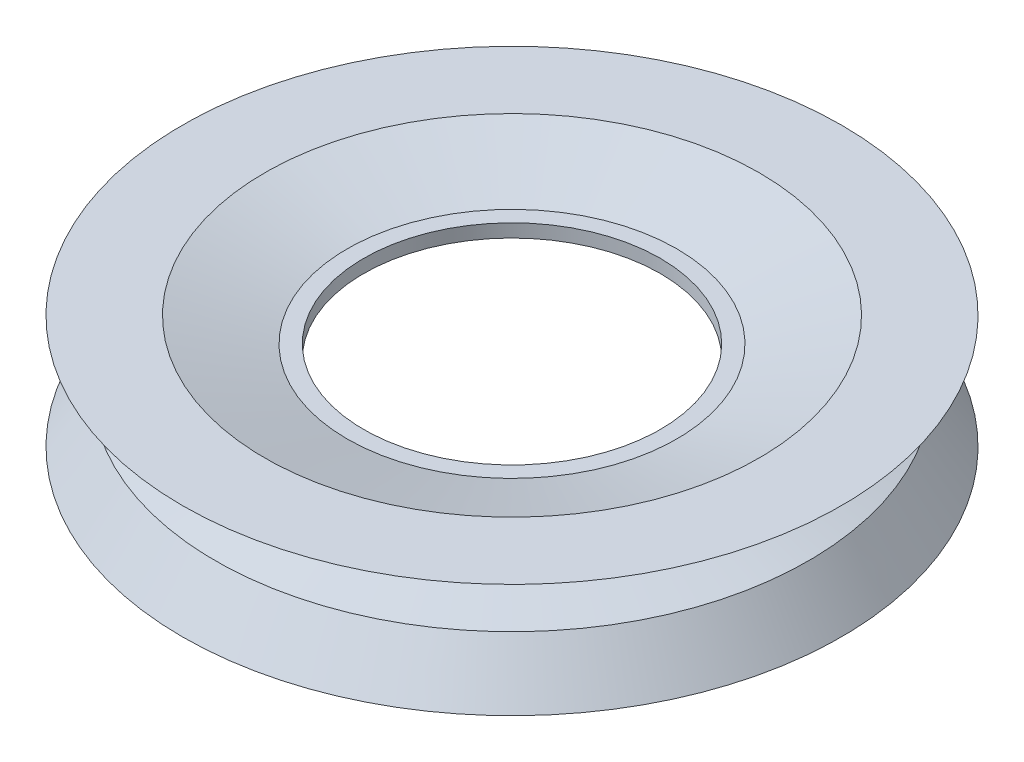
ISO-10303-21;
HEADER;
FILE_DESCRIPTION(('STEP AP214'),'2;1');
FILE_NAME('part.step','',(''),(''),'','','');
FILE_SCHEMA(('AUTOMOTIVE_DESIGN { 1 0 10303 214 1 1 1 1 }'));
ENDSEC;
DATA;
#1=APPLICATION_CONTEXT('core data for automotive mechanical design processes');
#2=APPLICATION_PROTOCOL_DEFINITION('international standard','automotive_design',2000,#1);
#3=PRODUCT_CONTEXT('',#1,'mechanical');
#4=PRODUCT('Part','Part','',(#3));
#5=PRODUCT_RELATED_PRODUCT_CATEGORY('part','',(#4));
#6=PRODUCT_DEFINITION_FORMATION('','',#4);
#7=PRODUCT_DEFINITION_CONTEXT('part definition',#1,'design');
#8=PRODUCT_DEFINITION('design','',#6,#7);
#9=PRODUCT_DEFINITION_SHAPE('','',#8);
#10=(LENGTH_UNIT() NAMED_UNIT(*) SI_UNIT(.MILLI.,.METRE.));
#11=(NAMED_UNIT(*) PLANE_ANGLE_UNIT() SI_UNIT($,.RADIAN.));
#12=(NAMED_UNIT(*) SI_UNIT($,.STERADIAN.) SOLID_ANGLE_UNIT());
#13=UNCERTAINTY_MEASURE_WITH_UNIT(LENGTH_MEASURE(1.E-05),#10,'distance_accuracy_value','');
#14=(GEOMETRIC_REPRESENTATION_CONTEXT(3) GLOBAL_UNCERTAINTY_ASSIGNED_CONTEXT((#13)) GLOBAL_UNIT_ASSIGNED_CONTEXT((#10,
#11,#12)) REPRESENTATION_CONTEXT('',''));
#15=CARTESIAN_POINT('',(0.,0.,0.));
#16=DIRECTION('',(0.,0.,1.));
#17=DIRECTION('',(1.,0.,0.));
#18=AXIS2_PLACEMENT_3D('',#15,#16,#17);
#19=CARTESIAN_POINT('',(0.,0.,0.));
#20=DIRECTION('',(0.,-1.,0.));
#21=DIRECTION('',(0.,0.,-1.));
#22=AXIS2_PLACEMENT_3D('',#19,#20,#21);
#23=CYLINDRICAL_SURFACE('',#22,8.5);
#24=CARTESIAN_POINT('',(0.,0.,0.));
#25=DIRECTION('',(0.,-1.,0.));
#26=DIRECTION('',(0.,0.,-1.));
#27=AXIS2_PLACEMENT_3D('',#24,#25,#26);
#28=CIRCLE('',#27,8.5);
#29=CARTESIAN_POINT('',(0.,0.,-8.5));
#30=VERTEX_POINT('',#29);
#31=EDGE_CURVE('E10',#30,#30,#28,.T.);
#32=ORIENTED_EDGE('',*,*,#31,.T.);
#33=EDGE_LOOP('',(#32));
#34=FACE_BOUND('',#33,.T.);
#35=CARTESIAN_POINT('',(0.,0.8,0.));
#36=DIRECTION('',(0.,-1.,0.));
#37=DIRECTION('',(0.,0.,-1.));
#38=AXIS2_PLACEMENT_3D('',#35,#36,#37);
#39=CIRCLE('',#38,8.5);
#40=CARTESIAN_POINT('',(0.,0.8,-8.5));
#41=VERTEX_POINT('',#40);
#42=EDGE_CURVE('E67',#41,#41,#39,.T.);
#43=ORIENTED_EDGE('',*,*,#42,.F.);
#44=EDGE_LOOP('',(#43));
#45=FACE_BOUND('',#44,.T.);
#46=ADVANCED_FACE('F33',(#34,#45),#23,.F.);
#47=CARTESIAN_POINT('',(8.5,0.,0.));
#48=DIRECTION('',(0.,-1.,0.));
#49=DIRECTION('',(0.,0.,-1.));
#50=AXIS2_PLACEMENT_3D('',#47,#48,#49);
#51=PLANE('',#50);
#52=CARTESIAN_POINT('',(0.,0.,0.));
#53=DIRECTION('',(0.,-1.,0.));
#54=DIRECTION('',(0.,0.,-1.));
#55=AXIS2_PLACEMENT_3D('',#52,#53,#54);
#56=CIRCLE('',#55,10.);
#57=CARTESIAN_POINT('',(0.,0.,-10.));
#58=VERTEX_POINT('',#57);
#59=EDGE_CURVE('E39',#58,#58,#56,.T.);
#60=ORIENTED_EDGE('',*,*,#59,.T.);
#61=EDGE_LOOP('',(#60));
#62=FACE_BOUND('',#61,.T.);
#63=ORIENTED_EDGE('',*,*,#31,.F.);
#64=EDGE_LOOP('',(#63));
#65=FACE_BOUND('',#64,.T.);
#66=ADVANCED_FACE('F75',(#62,#65),#51,.T.);
#67=CARTESIAN_POINT('',(0.,0.,0.));
#68=DIRECTION('',(0.,-1.,0.));
#69=DIRECTION('',(0.,0.,-1.));
#70=AXIS2_PLACEMENT_3D('',#67,#68,#69);
#71=CONICAL_SURFACE('',#70,10.,0.588002603547569);
#72=CARTESIAN_POINT('',(0.,1.5,0.));
#73=DIRECTION('',(0.,-1.,0.));
#74=DIRECTION('',(0.,0.,-1.));
#75=AXIS2_PLACEMENT_3D('',#72,#73,#74);
#76=CIRCLE('',#75,9.);
#77=CARTESIAN_POINT('',(0.,1.5,-9.));
#78=VERTEX_POINT('',#77);
#79=EDGE_CURVE('E43',#78,#78,#76,.T.);
#80=ORIENTED_EDGE('',*,*,#79,.T.);
#81=EDGE_LOOP('',(#80));
#82=FACE_BOUND('',#81,.T.);
#83=ORIENTED_EDGE('',*,*,#59,.F.);
#84=EDGE_LOOP('',(#83));
#85=FACE_BOUND('',#84,.T.);
#86=ADVANCED_FACE('F79',(#82,#85),#71,.T.);
#87=CARTESIAN_POINT('',(0.,1.5,0.));
#88=DIRECTION('',(0.,-1.,0.));
#89=DIRECTION('',(0.,0.,-1.));
#90=AXIS2_PLACEMENT_3D('',#87,#88,#89);
#91=CONICAL_SURFACE('',#90,9.,1.24904577239825);
#92=CARTESIAN_POINT('',(0.,2.5,0.));
#93=DIRECTION('',(0.,-1.,0.));
#94=DIRECTION('',(0.,0.,-1.));
#95=AXIS2_PLACEMENT_3D('',#92,#93,#94);
#96=CIRCLE('',#95,6.);
#97=CARTESIAN_POINT('',(0.,2.5,-6.));
#98=VERTEX_POINT('',#97);
#99=EDGE_CURVE('E47',#98,#98,#96,.T.);
#100=ORIENTED_EDGE('',*,*,#99,.T.);
#101=EDGE_LOOP('',(#100));
#102=FACE_BOUND('',#101,.T.);
#103=ORIENTED_EDGE('',*,*,#79,.F.);
#104=EDGE_LOOP('',(#103));
#105=FACE_BOUND('',#104,.T.);
#106=ADVANCED_FACE('F83',(#102,#105),#91,.T.);
#107=CARTESIAN_POINT('',(0.,2.5,0.));
#108=DIRECTION('',(0.,1.,0.));
#109=DIRECTION('',(0.,0.,1.));
#110=AXIS2_PLACEMENT_3D('',#107,#108,#109);
#111=CONICAL_SURFACE('',#110,6.,1.33761652614808);
#112=CARTESIAN_POINT('',(0.,3.45,0.));
#113=DIRECTION('',(0.,-1.,0.));
#114=DIRECTION('',(0.,0.,-1.));
#115=AXIS2_PLACEMENT_3D('',#112,#113,#114);
#116=CIRCLE('',#115,10.);
#117=CARTESIAN_POINT('',(0.,3.45,-10.));
#118=VERTEX_POINT('',#117);
#119=EDGE_CURVE('E52',#118,#118,#116,.T.);
#120=ORIENTED_EDGE('',*,*,#119,.T.);
#121=EDGE_LOOP('',(#120));
#122=FACE_BOUND('',#121,.T.);
#123=ORIENTED_EDGE('',*,*,#99,.F.);
#124=EDGE_LOOP('',(#123));
#125=FACE_BOUND('',#124,.T.);
#126=ADVANCED_FACE('F90',(#122,#125),#111,.T.);
#127=CARTESIAN_POINT('',(7.5,3.45,0.));
#128=DIRECTION('',(0.,1.,0.));
#129=DIRECTION('',(0.,0.,1.));
#130=AXIS2_PLACEMENT_3D('',#127,#128,#129);
#131=PLANE('',#130);
#132=CARTESIAN_POINT('',(0.,3.45,0.));
#133=DIRECTION('',(0.,-1.,0.));
#134=DIRECTION('',(0.,0.,-1.));
#135=AXIS2_PLACEMENT_3D('',#132,#133,#134);
#136=CIRCLE('',#135,7.5);
#137=CARTESIAN_POINT('',(0.,3.45,-7.5));
#138=VERTEX_POINT('',#137);
#139=EDGE_CURVE('E55',#138,#138,#136,.T.);
#140=ORIENTED_EDGE('',*,*,#139,.T.);
#141=EDGE_LOOP('',(#140));
#142=FACE_BOUND('',#141,.T.);
#143=ORIENTED_EDGE('',*,*,#119,.F.);
#144=EDGE_LOOP('',(#143));
#145=FACE_BOUND('',#144,.T.);
#146=ADVANCED_FACE('F94',(#142,#145),#131,.T.);
#147=CARTESIAN_POINT('',(0.,3.45,0.));
#148=DIRECTION('',(0.,1.,0.));
#149=DIRECTION('',(0.,0.,1.));
#150=AXIS2_PLACEMENT_3D('',#147,#148,#149);
#151=CONICAL_SURFACE('',#150,7.5,1.27933953231703);
#152=CARTESIAN_POINT('',(0.,2.69999999999999,0.));
#153=DIRECTION('',(0.,-1.,0.));
#154=DIRECTION('',(0.,0.,-1.));
#155=AXIS2_PLACEMENT_3D('',#152,#153,#154);
#156=CIRCLE('',#155,5.);
#157=CARTESIAN_POINT('',(0.,2.69999999999999,-5.));
#158=VERTEX_POINT('',#157);
#159=EDGE_CURVE('E58',#158,#158,#156,.T.);
#160=ORIENTED_EDGE('',*,*,#159,.T.);
#161=EDGE_LOOP('',(#160));
#162=FACE_BOUND('',#161,.T.);
#163=ORIENTED_EDGE('',*,*,#139,.F.);
#164=EDGE_LOOP('',(#163));
#165=FACE_BOUND('',#164,.T.);
#166=ADVANCED_FACE('F98',(#162,#165),#151,.F.);
#167=CARTESIAN_POINT('',(5.,2.7,0.));
#168=DIRECTION('',(0.,1.,0.));
#169=DIRECTION('',(0.,0.,1.));
#170=AXIS2_PLACEMENT_3D('',#167,#168,#169);
#171=PLANE('',#170);
#172=CARTESIAN_POINT('',(0.,2.7,0.));
#173=DIRECTION('',(0.,-1.,0.));
#174=DIRECTION('',(0.,0.,-1.));
#175=AXIS2_PLACEMENT_3D('',#172,#173,#174);
#176=CIRCLE('',#175,4.5);
#177=CARTESIAN_POINT('',(0.,2.7,-4.5));
#178=VERTEX_POINT('',#177);
#179=EDGE_CURVE('E61',#178,#178,#176,.T.);
#180=ORIENTED_EDGE('',*,*,#179,.T.);
#181=EDGE_LOOP('',(#180));
#182=FACE_BOUND('',#181,.T.);
#183=ORIENTED_EDGE('',*,*,#159,.F.);
#184=EDGE_LOOP('',(#183));
#185=FACE_BOUND('',#184,.T.);
#186=ADVANCED_FACE('F102',(#182,#185),#171,.T.);
#187=CARTESIAN_POINT('',(0.,0.,0.));
#188=DIRECTION('',(0.,-1.,0.));
#189=DIRECTION('',(0.,0.,-1.));
#190=AXIS2_PLACEMENT_3D('',#187,#188,#189);
#191=CYLINDRICAL_SURFACE('',#190,4.5);
#192=CARTESIAN_POINT('',(0.,2.3,0.));
#193=DIRECTION('',(0.,-1.,0.));
#194=DIRECTION('',(0.,0.,-1.));
#195=AXIS2_PLACEMENT_3D('',#192,#193,#194);
#196=CIRCLE('',#195,4.5);
#197=CARTESIAN_POINT('',(0.,2.3,-4.5));
#198=VERTEX_POINT('',#197);
#199=EDGE_CURVE('E64',#198,#198,#196,.T.);
#200=ORIENTED_EDGE('',*,*,#199,.T.);
#201=EDGE_LOOP('',(#200));
#202=FACE_BOUND('',#201,.T.);
#203=ORIENTED_EDGE('',*,*,#179,.F.);
#204=EDGE_LOOP('',(#203));
#205=FACE_BOUND('',#204,.T.);
#206=ADVANCED_FACE('F106',(#202,#205),#191,.F.);
#207=CARTESIAN_POINT('',(0.,2.3,0.));
#208=DIRECTION('',(0.,-1.,0.));
#209=DIRECTION('',(0.,0.,-1.));
#210=AXIS2_PLACEMENT_3D('',#207,#208,#209);
#211=CONICAL_SURFACE('',#210,4.5,1.21202565652432);
#212=ORIENTED_EDGE('',*,*,#42,.T.);
#213=EDGE_LOOP('',(#212));
#214=FACE_BOUND('',#213,.T.);
#215=ORIENTED_EDGE('',*,*,#199,.F.);
#216=EDGE_LOOP('',(#215));
#217=FACE_BOUND('',#216,.T.);
#218=ADVANCED_FACE('F71',(#214,#217),#211,.F.);
#219=CLOSED_SHELL('',(#46,#66,#86,#106,#126,#146,#166,#186,#206,#218));
#220=MANIFOLD_SOLID_BREP('B2',#219);
#221=ADVANCED_BREP_SHAPE_REPRESENTATION('',(#18,#220),#14);
#222=SHAPE_DEFINITION_REPRESENTATION(#9,#221);
ENDSEC;
END-ISO-10303-21;
